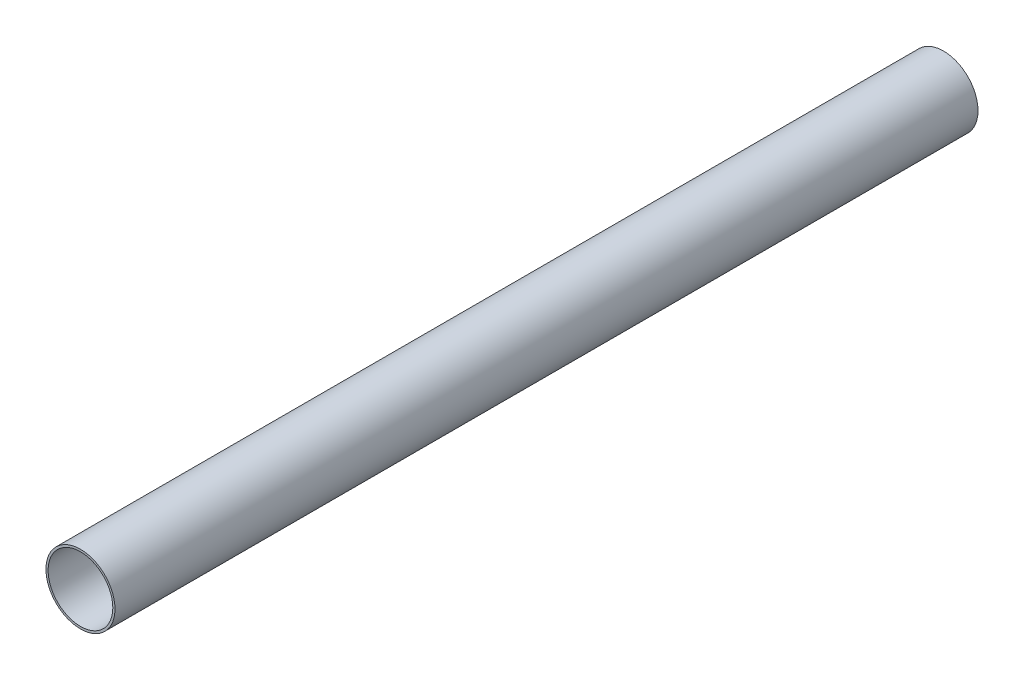
ISO-10303-21;
HEADER;
FILE_DESCRIPTION(('STEP AP214'),'2;1');
FILE_NAME('part.step','',(''),(''),'','','');
FILE_SCHEMA(('AUTOMOTIVE_DESIGN { 1 0 10303 214 1 1 1 1 }'));
ENDSEC;
DATA;
#1=APPLICATION_CONTEXT('core data for automotive mechanical design processes');
#2=APPLICATION_PROTOCOL_DEFINITION('international standard','automotive_design',2000,#1);
#3=PRODUCT_CONTEXT('',#1,'mechanical');
#4=PRODUCT('Part','Part','',(#3));
#5=PRODUCT_RELATED_PRODUCT_CATEGORY('part','',(#4));
#6=PRODUCT_DEFINITION_FORMATION('','',#4);
#7=PRODUCT_DEFINITION_CONTEXT('part definition',#1,'design');
#8=PRODUCT_DEFINITION('design','',#6,#7);
#9=PRODUCT_DEFINITION_SHAPE('','',#8);
#10=(LENGTH_UNIT() NAMED_UNIT(*) SI_UNIT(.MILLI.,.METRE.));
#11=(NAMED_UNIT(*) PLANE_ANGLE_UNIT() SI_UNIT($,.RADIAN.));
#12=(NAMED_UNIT(*) SI_UNIT($,.STERADIAN.) SOLID_ANGLE_UNIT());
#13=UNCERTAINTY_MEASURE_WITH_UNIT(LENGTH_MEASURE(1.E-05),#10,'distance_accuracy_value','');
#14=(GEOMETRIC_REPRESENTATION_CONTEXT(3) GLOBAL_UNCERTAINTY_ASSIGNED_CONTEXT((#13)) GLOBAL_UNIT_ASSIGNED_CONTEXT((#10,
#11,#12)) REPRESENTATION_CONTEXT('',''));
#15=CARTESIAN_POINT('',(0.,0.,0.));
#16=DIRECTION('',(0.,0.,1.));
#17=DIRECTION('',(1.,0.,0.));
#18=AXIS2_PLACEMENT_3D('',#15,#16,#17);
#19=CARTESIAN_POINT('',(0.,0.,400.));
#20=DIRECTION('',(0.,0.,1.));
#21=DIRECTION('',(1.,0.,0.));
#22=AXIS2_PLACEMENT_3D('',#19,#20,#21);
#23=PLANE('',#22);
#24=CARTESIAN_POINT('',(0.,0.,400.));
#25=DIRECTION('',(0.,0.,1.));
#26=DIRECTION('',(1.,0.,0.));
#27=AXIS2_PLACEMENT_3D('',#24,#25,#26);
#28=CIRCLE('',#27,16.);
#29=CARTESIAN_POINT('',(16.,0.,400.));
#30=VERTEX_POINT('',#29);
#31=EDGE_CURVE('E10',#30,#30,#28,.T.);
#32=ORIENTED_EDGE('',*,*,#31,.T.);
#33=EDGE_LOOP('',(#32));
#34=FACE_BOUND('',#33,.T.);
#35=CARTESIAN_POINT('',(0.,0.,400.));
#36=DIRECTION('',(0.,0.,1.));
#37=DIRECTION('',(1.,0.,0.));
#38=AXIS2_PLACEMENT_3D('',#35,#36,#37);
#39=CIRCLE('',#38,15.);
#40=CARTESIAN_POINT('',(15.,0.,400.));
#41=VERTEX_POINT('',#40);
#42=EDGE_CURVE('E42',#41,#41,#39,.T.);
#43=ORIENTED_EDGE('',*,*,#42,.F.);
#44=EDGE_LOOP('',(#43));
#45=FACE_BOUND('',#44,.T.);
#46=ADVANCED_FACE('F31',(#34,#45),#23,.T.);
#47=CARTESIAN_POINT('',(0.,0.,0.));
#48=DIRECTION('',(0.,0.,1.));
#49=DIRECTION('',(1.,0.,0.));
#50=AXIS2_PLACEMENT_3D('',#47,#48,#49);
#51=PLANE('',#50);
#52=CARTESIAN_POINT('',(0.,0.,0.));
#53=DIRECTION('',(0.,0.,1.));
#54=DIRECTION('',(1.,0.,0.));
#55=AXIS2_PLACEMENT_3D('',#52,#53,#54);
#56=CIRCLE('',#55,16.);
#57=CARTESIAN_POINT('',(16.,0.,0.));
#58=VERTEX_POINT('',#57);
#59=EDGE_CURVE('E35',#58,#58,#56,.T.);
#60=ORIENTED_EDGE('',*,*,#59,.F.);
#61=EDGE_LOOP('',(#60));
#62=FACE_BOUND('',#61,.T.);
#63=CARTESIAN_POINT('',(0.,0.,0.));
#64=DIRECTION('',(0.,0.,1.));
#65=DIRECTION('',(1.,0.,0.));
#66=AXIS2_PLACEMENT_3D('',#63,#64,#65);
#67=CIRCLE('',#66,15.);
#68=CARTESIAN_POINT('',(15.,0.,0.));
#69=VERTEX_POINT('',#68);
#70=EDGE_CURVE('E44',#69,#69,#67,.T.);
#71=ORIENTED_EDGE('',*,*,#70,.T.);
#72=EDGE_LOOP('',(#71));
#73=FACE_BOUND('',#72,.T.);
#74=ADVANCED_FACE('F54',(#62,#73),#51,.F.);
#75=CARTESIAN_POINT('',(0.,0.,400.));
#76=DIRECTION('',(0.,0.,-1.));
#77=DIRECTION('',(-1.,0.,0.));
#78=AXIS2_PLACEMENT_3D('',#75,#76,#77);
#79=CYLINDRICAL_SURFACE('',#78,16.);
#80=ORIENTED_EDGE('',*,*,#31,.F.);
#81=EDGE_LOOP('',(#80));
#82=FACE_BOUND('',#81,.T.);
#83=ORIENTED_EDGE('',*,*,#59,.T.);
#84=EDGE_LOOP('',(#83));
#85=FACE_BOUND('',#84,.T.);
#86=ADVANCED_FACE('F33',(#82,#85),#79,.T.);
#87=CARTESIAN_POINT('',(0.,0.,400.));
#88=DIRECTION('',(0.,0.,-1.));
#89=DIRECTION('',(-1.,0.,0.));
#90=AXIS2_PLACEMENT_3D('',#87,#88,#89);
#91=CYLINDRICAL_SURFACE('',#90,15.);
#92=ORIENTED_EDGE('',*,*,#42,.T.);
#93=EDGE_LOOP('',(#92));
#94=FACE_BOUND('',#93,.T.);
#95=ORIENTED_EDGE('',*,*,#70,.F.);
#96=EDGE_LOOP('',(#95));
#97=FACE_BOUND('',#96,.T.);
#98=ADVANCED_FACE('F50',(#94,#97),#91,.F.);
#99=CLOSED_SHELL('',(#46,#74,#86,#98));
#100=MANIFOLD_SOLID_BREP('B2',#99);
#101=ADVANCED_BREP_SHAPE_REPRESENTATION('',(#18,#100),#14);
#102=SHAPE_DEFINITION_REPRESENTATION(#9,#101);
ENDSEC;
END-ISO-10303-21;
